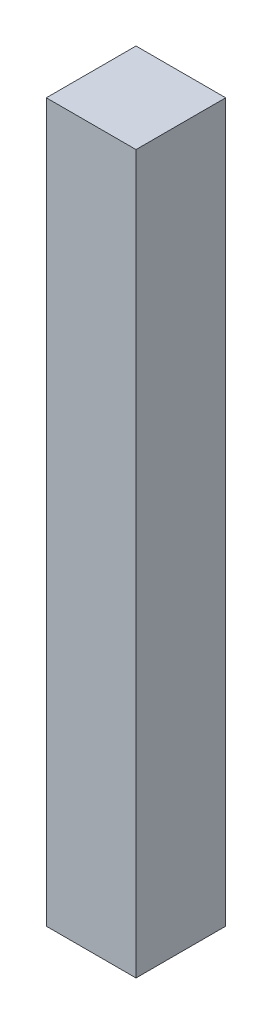
ISO-10303-21;
HEADER;
FILE_DESCRIPTION(('STEP AP214'),'2;1');
FILE_NAME('part.step','',(''),(''),'','','');
FILE_SCHEMA(('AUTOMOTIVE_DESIGN { 1 0 10303 214 1 1 1 1 }'));
ENDSEC;
DATA;
#1=APPLICATION_CONTEXT('core data for automotive mechanical design processes');
#2=APPLICATION_PROTOCOL_DEFINITION('international standard','automotive_design',2000,#1);
#3=PRODUCT_CONTEXT('',#1,'mechanical');
#4=PRODUCT('Part','Part','',(#3));
#5=PRODUCT_RELATED_PRODUCT_CATEGORY('part','',(#4));
#6=PRODUCT_DEFINITION_FORMATION('','',#4);
#7=PRODUCT_DEFINITION_CONTEXT('part definition',#1,'design');
#8=PRODUCT_DEFINITION('design','',#6,#7);
#9=PRODUCT_DEFINITION_SHAPE('','',#8);
#10=(LENGTH_UNIT() NAMED_UNIT(*) SI_UNIT(.MILLI.,.METRE.));
#11=(NAMED_UNIT(*) PLANE_ANGLE_UNIT() SI_UNIT($,.RADIAN.));
#12=(NAMED_UNIT(*) SI_UNIT($,.STERADIAN.) SOLID_ANGLE_UNIT());
#13=UNCERTAINTY_MEASURE_WITH_UNIT(LENGTH_MEASURE(1.E-05),#10,'distance_accuracy_value','');
#14=(GEOMETRIC_REPRESENTATION_CONTEXT(3) GLOBAL_UNCERTAINTY_ASSIGNED_CONTEXT((#13)) GLOBAL_UNIT_ASSIGNED_CONTEXT((#10,
#11,#12)) REPRESENTATION_CONTEXT('',''));
#15=CARTESIAN_POINT('',(0.,0.,0.));
#16=DIRECTION('',(0.,0.,1.));
#17=DIRECTION('',(1.,0.,0.));
#18=AXIS2_PLACEMENT_3D('',#15,#16,#17);
#19=CARTESIAN_POINT('',(25.,-200.,50.));
#20=DIRECTION('',(-1.,0.,0.));
#21=DIRECTION('',(0.,-1.,0.));
#22=AXIS2_PLACEMENT_3D('',#19,#20,#21);
#23=PLANE('',#22);
#24=DIRECTION('',(0.,1.,0.));
#25=VECTOR('',#24,1.);
#26=CARTESIAN_POINT('',(25.,-200.,0.));
#27=LINE('',#26,#25);
#28=CARTESIAN_POINT('',(25.,-200.,0.));
#29=VERTEX_POINT('',#28);
#30=CARTESIAN_POINT('',(25.,200.,0.));
#31=VERTEX_POINT('',#30);
#32=EDGE_CURVE('E104',#29,#31,#27,.T.);
#33=ORIENTED_EDGE('',*,*,#32,.T.);
#34=DIRECTION('',(0.,0.,-1.));
#35=VECTOR('',#34,1.);
#36=CARTESIAN_POINT('',(25.,200.,50.));
#37=LINE('',#36,#35);
#38=CARTESIAN_POINT('',(25.,200.,50.));
#39=VERTEX_POINT('',#38);
#40=EDGE_CURVE('E11',#39,#31,#37,.T.);
#41=ORIENTED_EDGE('',*,*,#40,.F.);
#42=DIRECTION('',(0.,1.,0.));
#43=VECTOR('',#42,1.);
#44=CARTESIAN_POINT('',(25.,-200.,50.));
#45=LINE('',#44,#43);
#46=CARTESIAN_POINT('',(25.,-200.,50.));
#47=VERTEX_POINT('',#46);
#48=EDGE_CURVE('E92',#47,#39,#45,.T.);
#49=ORIENTED_EDGE('',*,*,#48,.F.);
#50=DIRECTION('',(0.,0.,-1.));
#51=VECTOR('',#50,1.);
#52=CARTESIAN_POINT('',(25.,-200.,50.));
#53=LINE('',#52,#51);
#54=EDGE_CURVE('E100',#47,#29,#53,.T.);
#55=ORIENTED_EDGE('',*,*,#54,.T.);
#56=EDGE_LOOP('',(#33,#41,#49,#55));
#57=FACE_BOUND('',#56,.T.);
#58=ADVANCED_FACE('F41',(#57),#23,.F.);
#59=CARTESIAN_POINT('',(-25.,200.,50.));
#60=DIRECTION('',(0.,-1.,0.));
#61=DIRECTION('',(0.,0.,-1.));
#62=AXIS2_PLACEMENT_3D('',#59,#60,#61);
#63=PLANE('',#62);
#64=DIRECTION('',(-1.,0.,0.));
#65=VECTOR('',#64,1.);
#66=CARTESIAN_POINT('',(-25.,200.,0.));
#67=LINE('',#66,#65);
#68=CARTESIAN_POINT('',(-25.,200.,0.));
#69=VERTEX_POINT('',#68);
#70=EDGE_CURVE('E96',#31,#69,#67,.T.);
#71=ORIENTED_EDGE('',*,*,#70,.T.);
#72=DIRECTION('',(0.,0.,-1.));
#73=VECTOR('',#72,1.);
#74=CARTESIAN_POINT('',(-25.,200.,50.));
#75=LINE('',#74,#73);
#76=CARTESIAN_POINT('',(-25.,200.,50.));
#77=VERTEX_POINT('',#76);
#78=EDGE_CURVE('E49',#77,#69,#75,.T.);
#79=ORIENTED_EDGE('',*,*,#78,.F.);
#80=DIRECTION('',(-1.,0.,0.));
#81=VECTOR('',#80,1.);
#82=CARTESIAN_POINT('',(-25.,200.,50.));
#83=LINE('',#82,#81);
#84=EDGE_CURVE('E87',#39,#77,#83,.T.);
#85=ORIENTED_EDGE('',*,*,#84,.F.);
#86=ORIENTED_EDGE('',*,*,#40,.T.);
#87=EDGE_LOOP('',(#71,#79,#85,#86));
#88=FACE_BOUND('',#87,.T.);
#89=ADVANCED_FACE('F95',(#88),#63,.F.);
#90=CARTESIAN_POINT('',(-25.,-200.,50.));
#91=DIRECTION('',(1.,0.,0.));
#92=DIRECTION('',(0.,1.,0.));
#93=AXIS2_PLACEMENT_3D('',#90,#91,#92);
#94=PLANE('',#93);
#95=DIRECTION('',(0.,-1.,0.));
#96=VECTOR('',#95,1.);
#97=CARTESIAN_POINT('',(-25.,-200.,0.));
#98=LINE('',#97,#96);
#99=CARTESIAN_POINT('',(-25.,-200.,0.));
#100=VERTEX_POINT('',#99);
#101=EDGE_CURVE('E74',#69,#100,#98,.T.);
#102=ORIENTED_EDGE('',*,*,#101,.T.);
#103=DIRECTION('',(0.,0.,-1.));
#104=VECTOR('',#103,1.);
#105=CARTESIAN_POINT('',(-25.,-200.,50.));
#106=LINE('',#105,#104);
#107=CARTESIAN_POINT('',(-25.,-200.,50.));
#108=VERTEX_POINT('',#107);
#109=EDGE_CURVE('E97',#108,#100,#106,.T.);
#110=ORIENTED_EDGE('',*,*,#109,.F.);
#111=DIRECTION('',(0.,-1.,0.));
#112=VECTOR('',#111,1.);
#113=CARTESIAN_POINT('',(-25.,-200.,50.));
#114=LINE('',#113,#112);
#115=EDGE_CURVE('E90',#77,#108,#114,.T.);
#116=ORIENTED_EDGE('',*,*,#115,.F.);
#117=ORIENTED_EDGE('',*,*,#78,.T.);
#118=EDGE_LOOP('',(#102,#110,#116,#117));
#119=FACE_BOUND('',#118,.T.);
#120=ADVANCED_FACE('F98',(#119),#94,.F.);
#121=CARTESIAN_POINT('',(-25.,-200.,50.));
#122=DIRECTION('',(0.,1.,0.));
#123=DIRECTION('',(0.,0.,1.));
#124=AXIS2_PLACEMENT_3D('',#121,#122,#123);
#125=PLANE('',#124);
#126=DIRECTION('',(1.,0.,0.));
#127=VECTOR('',#126,1.);
#128=CARTESIAN_POINT('',(-25.,-200.,0.));
#129=LINE('',#128,#127);
#130=EDGE_CURVE('E80',#100,#29,#129,.T.);
#131=ORIENTED_EDGE('',*,*,#130,.T.);
#132=ORIENTED_EDGE('',*,*,#54,.F.);
#133=DIRECTION('',(1.,0.,0.));
#134=VECTOR('',#133,1.);
#135=CARTESIAN_POINT('',(-25.,-200.,50.));
#136=LINE('',#135,#134);
#137=EDGE_CURVE('E57',#108,#47,#136,.T.);
#138=ORIENTED_EDGE('',*,*,#137,.F.);
#139=ORIENTED_EDGE('',*,*,#109,.T.);
#140=EDGE_LOOP('',(#131,#132,#138,#139));
#141=FACE_BOUND('',#140,.T.);
#142=ADVANCED_FACE('F111',(#141),#125,.F.);
#143=CARTESIAN_POINT('',(0.,0.,50.));
#144=DIRECTION('',(0.,0.,-1.));
#145=DIRECTION('',(-1.,0.,0.));
#146=AXIS2_PLACEMENT_3D('',#143,#144,#145);
#147=PLANE('',#146);
#148=ORIENTED_EDGE('',*,*,#48,.T.);
#149=ORIENTED_EDGE('',*,*,#84,.T.);
#150=ORIENTED_EDGE('',*,*,#115,.T.);
#151=ORIENTED_EDGE('',*,*,#137,.T.);
#152=EDGE_LOOP('',(#148,#149,#150,#151));
#153=FACE_BOUND('',#152,.T.);
#154=ADVANCED_FACE('F88',(#153),#147,.F.);
#155=CARTESIAN_POINT('',(0.,0.,0.));
#156=DIRECTION('',(0.,0.,-1.));
#157=DIRECTION('',(-1.,0.,0.));
#158=AXIS2_PLACEMENT_3D('',#155,#156,#157);
#159=PLANE('',#158);
#160=ORIENTED_EDGE('',*,*,#32,.F.);
#161=ORIENTED_EDGE('',*,*,#130,.F.);
#162=ORIENTED_EDGE('',*,*,#101,.F.);
#163=ORIENTED_EDGE('',*,*,#70,.F.);
#164=EDGE_LOOP('',(#160,#161,#162,#163));
#165=FACE_BOUND('',#164,.T.);
#166=ADVANCED_FACE('F114',(#165),#159,.T.);
#167=CLOSED_SHELL('',(#58,#89,#120,#142,#154,#166));
#168=MANIFOLD_SOLID_BREP('B2',#167);
#169=ADVANCED_BREP_SHAPE_REPRESENTATION('',(#18,#168),#14);
#170=SHAPE_DEFINITION_REPRESENTATION(#9,#169);
ENDSEC;
END-ISO-10303-21;
